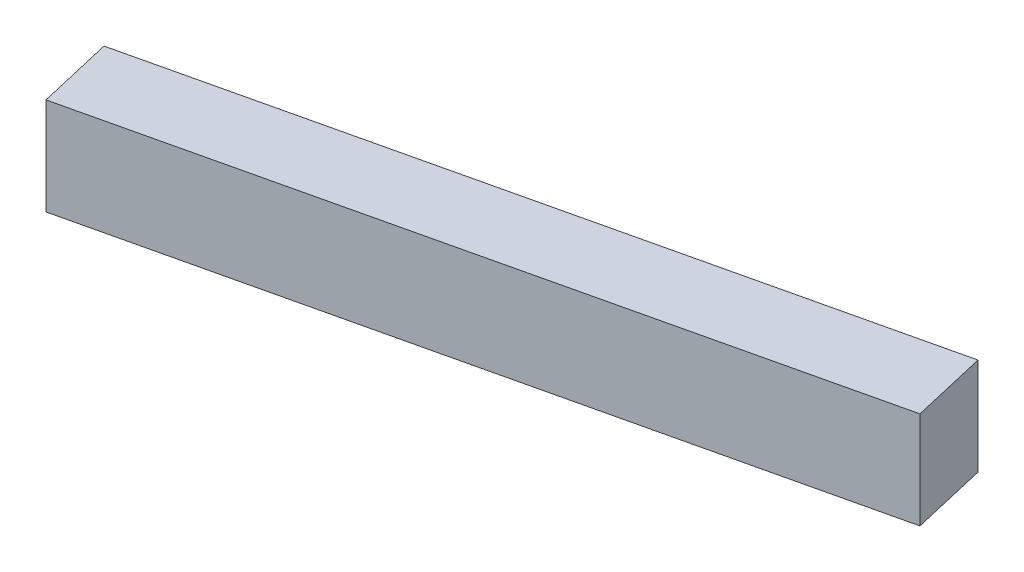
ISO-10303-21;
HEADER;
FILE_DESCRIPTION(('STEP AP214'),'2;1');
FILE_NAME('part.step','',(''),(''),'','','');
FILE_SCHEMA(('AUTOMOTIVE_DESIGN { 1 0 10303 214 1 1 1 1 }'));
ENDSEC;
DATA;
#1=APPLICATION_CONTEXT('core data for automotive mechanical design processes');
#2=APPLICATION_PROTOCOL_DEFINITION('international standard','automotive_design',2000,#1);
#3=PRODUCT_CONTEXT('',#1,'mechanical');
#4=PRODUCT('Part','Part','',(#3));
#5=PRODUCT_RELATED_PRODUCT_CATEGORY('part','',(#4));
#6=PRODUCT_DEFINITION_FORMATION('','',#4);
#7=PRODUCT_DEFINITION_CONTEXT('part definition',#1,'design');
#8=PRODUCT_DEFINITION('design','',#6,#7);
#9=PRODUCT_DEFINITION_SHAPE('','',#8);
#10=(LENGTH_UNIT() NAMED_UNIT(*) SI_UNIT(.MILLI.,.METRE.));
#11=(NAMED_UNIT(*) PLANE_ANGLE_UNIT() SI_UNIT($,.RADIAN.));
#12=(NAMED_UNIT(*) SI_UNIT($,.STERADIAN.) SOLID_ANGLE_UNIT());
#13=UNCERTAINTY_MEASURE_WITH_UNIT(LENGTH_MEASURE(1.E-05),#10,'distance_accuracy_value','');
#14=(GEOMETRIC_REPRESENTATION_CONTEXT(3) GLOBAL_UNCERTAINTY_ASSIGNED_CONTEXT((#13)) GLOBAL_UNIT_ASSIGNED_CONTEXT((#10,
#11,#12)) REPRESENTATION_CONTEXT('',''));
#15=CARTESIAN_POINT('',(0.,0.,0.));
#16=DIRECTION('',(0.,0.,1.));
#17=DIRECTION('',(1.,0.,0.));
#18=AXIS2_PLACEMENT_3D('',#15,#16,#17);
#19=CARTESIAN_POINT('',(17.5061287334921,7.874,-4.17952499772163));
#20=DIRECTION('',(0.226787297927744,0.,0.9739443112923));
#21=DIRECTION('',(0.9739443112923,0.,-0.226787297927744));
#22=AXIS2_PLACEMENT_3D('',#19,#20,#21);
#23=PLANE('',#22);
#24=DIRECTION('',(0.,1.,0.));
#25=VECTOR('',#24,1.);
#26=CARTESIAN_POINT('',(17.5061287334921,7.874,-4.17952499772163));
#27=LINE('',#26,#25);
#28=CARTESIAN_POINT('',(17.5061287334921,7.62,-4.17952499772163));
#29=VERTEX_POINT('',#28);
#30=CARTESIAN_POINT('',(17.5061287334921,7.874,-4.17952499772163));
#31=VERTEX_POINT('',#30);
#32=EDGE_CURVE('E20',#29,#31,#27,.T.);
#33=ORIENTED_EDGE('',*,*,#32,.T.);
#34=DIRECTION('',(0.973944311292298,0.,-0.226787297927751));
#35=VECTOR('',#34,1.);
#36=CARTESIAN_POINT('',(17.5061287334921,7.874,-4.17952499772163));
#37=LINE('',#36,#35);
#38=CARTESIAN_POINT('',(19.3614926465039,7.874,-4.61155480027399));
#39=VERTEX_POINT('',#38);
#40=EDGE_CURVE('E55',#31,#39,#37,.T.);
#41=ORIENTED_EDGE('',*,*,#40,.T.);
#42=DIRECTION('',(0.,1.,0.));
#43=VECTOR('',#42,1.);
#44=CARTESIAN_POINT('',(19.3614926465039,7.874,-4.61155480027399));
#45=LINE('',#44,#43);
#46=CARTESIAN_POINT('',(19.3614926465039,7.62,-4.61155480027398));
#47=VERTEX_POINT('',#46);
#48=EDGE_CURVE('E76',#39,#47,#45,.F.);
#49=ORIENTED_EDGE('',*,*,#48,.T.);
#50=DIRECTION('',(0.973944311292298,0.,-0.226787297927751));
#51=VECTOR('',#50,1.);
#52=CARTESIAN_POINT('',(17.5061287334921,7.62,-4.17952499772163));
#53=LINE('',#52,#51);
#54=EDGE_CURVE('E58',#29,#47,#53,.T.);
#55=ORIENTED_EDGE('',*,*,#54,.F.);
#56=EDGE_LOOP('',(#33,#41,#49,#55));
#57=FACE_BOUND('',#56,.T.);
#58=ADVANCED_FACE('F17',(#57),#23,.F.);
#59=CARTESIAN_POINT('',(17.5061287334921,7.874,-4.17952499772163));
#60=DIRECTION('',(0.973944311292292,0.,-0.22678729792778));
#61=DIRECTION('',(-0.22678729792778,0.,-0.973944311292292));
#62=AXIS2_PLACEMENT_3D('',#59,#60,#61);
#63=PLANE('',#62);
#64=DIRECTION('',(0.,1.,0.));
#65=VECTOR('',#64,1.);
#66=CARTESIAN_POINT('',(17.552211912431,7.874,-3.98161951366704));
#67=LINE('',#66,#65);
#68=CARTESIAN_POINT('',(17.552211912431,7.62,-3.98161951366704));
#69=VERTEX_POINT('',#68);
#70=CARTESIAN_POINT('',(17.552211912431,7.874,-3.98161951366704));
#71=VERTEX_POINT('',#70);
#72=EDGE_CURVE('E73',#69,#71,#67,.T.);
#73=ORIENTED_EDGE('',*,*,#72,.T.);
#74=DIRECTION('',(-0.226787297927654,0.,-0.973944311292321));
#75=VECTOR('',#74,1.);
#76=CARTESIAN_POINT('',(17.552211912431,7.874,-3.98161951366704));
#77=LINE('',#76,#75);
#78=EDGE_CURVE('E63',#71,#31,#77,.T.);
#79=ORIENTED_EDGE('',*,*,#78,.T.);
#80=ORIENTED_EDGE('',*,*,#32,.F.);
#81=DIRECTION('',(-0.226787297927654,0.,-0.973944311292321));
#82=VECTOR('',#81,1.);
#83=CARTESIAN_POINT('',(17.552211912431,7.62,-3.98161951366704));
#84=LINE('',#83,#82);
#85=EDGE_CURVE('E80',#69,#29,#84,.T.);
#86=ORIENTED_EDGE('',*,*,#85,.F.);
#87=EDGE_LOOP('',(#73,#79,#80,#86));
#88=FACE_BOUND('',#87,.T.);
#89=ADVANCED_FACE('F72',(#88),#63,.F.);
#90=CARTESIAN_POINT('',(17.5061287334921,7.874,-4.17952499772163));
#91=DIRECTION('',(0.,-1.,0.));
#92=DIRECTION('',(0.,0.,-1.));
#93=AXIS2_PLACEMENT_3D('',#90,#91,#92);
#94=PLANE('',#93);
#95=ORIENTED_EDGE('',*,*,#78,.F.);
#96=DIRECTION('',(-0.973944311292301,0.,0.226787297927741));
#97=VECTOR('',#96,1.);
#98=CARTESIAN_POINT('',(17.552211912431,7.874,-3.98161951366704));
#99=LINE('',#98,#97);
#100=CARTESIAN_POINT('',(19.4075758257441,7.874,-4.41364931628954));
#101=VERTEX_POINT('',#100);
#102=EDGE_CURVE('E83',#71,#101,#99,.F.);
#103=ORIENTED_EDGE('',*,*,#102,.T.);
#104=DIRECTION('',(0.226787299410367,0.,0.973944310947065));
#105=VECTOR('',#104,1.);
#106=CARTESIAN_POINT('',(19.3614926465039,7.874,-4.61155480027399));
#107=LINE('',#106,#105);
#108=EDGE_CURVE('E69',#101,#39,#107,.F.);
#109=ORIENTED_EDGE('',*,*,#108,.T.);
#110=ORIENTED_EDGE('',*,*,#40,.F.);
#111=EDGE_LOOP('',(#95,#103,#109,#110));
#112=FACE_BOUND('',#111,.T.);
#113=ADVANCED_FACE('F66',(#112),#94,.F.);
#114=CARTESIAN_POINT('',(19.3614926465039,7.874,-4.61155480027399));
#115=DIRECTION('',(-0.973944310947065,0.,0.226787299410367));
#116=DIRECTION('',(0.226787299410367,0.,0.973944310947065));
#117=AXIS2_PLACEMENT_3D('',#114,#115,#116);
#118=PLANE('',#117);
#119=ORIENTED_EDGE('',*,*,#48,.F.);
#120=ORIENTED_EDGE('',*,*,#108,.F.);
#121=DIRECTION('',(0.,1.,0.));
#122=VECTOR('',#121,1.);
#123=CARTESIAN_POINT('',(19.4075758257441,7.874,-4.41364931628954));
#124=LINE('',#123,#122);
#125=CARTESIAN_POINT('',(19.4075758257441,7.62,-4.41364931628954));
#126=VERTEX_POINT('',#125);
#127=EDGE_CURVE('E26',#101,#126,#124,.F.);
#128=ORIENTED_EDGE('',*,*,#127,.T.);
#129=DIRECTION('',(0.226787299410429,0.,0.97394431094705));
#130=VECTOR('',#129,1.);
#131=CARTESIAN_POINT('',(19.3614926465039,7.62,-4.61155480027399));
#132=LINE('',#131,#130);
#133=EDGE_CURVE('E34',#47,#126,#132,.T.);
#134=ORIENTED_EDGE('',*,*,#133,.F.);
#135=EDGE_LOOP('',(#119,#120,#128,#134));
#136=FACE_BOUND('',#135,.T.);
#137=ADVANCED_FACE('F88',(#136),#118,.F.);
#138=CARTESIAN_POINT('',(17.5061287334921,7.62,-4.17952499772163));
#139=DIRECTION('',(0.,-1.,0.));
#140=DIRECTION('',(0.,0.,-1.));
#141=AXIS2_PLACEMENT_3D('',#138,#139,#140);
#142=PLANE('',#141);
#143=DIRECTION('',(-0.973944311292301,0.,0.226787297927741));
#144=VECTOR('',#143,1.);
#145=CARTESIAN_POINT('',(17.552211912431,7.62,-3.98161951366704));
#146=LINE('',#145,#144);
#147=EDGE_CURVE('E11',#126,#69,#146,.T.);
#148=ORIENTED_EDGE('',*,*,#147,.T.);
#149=ORIENTED_EDGE('',*,*,#85,.T.);
#150=ORIENTED_EDGE('',*,*,#54,.T.);
#151=ORIENTED_EDGE('',*,*,#133,.T.);
#152=EDGE_LOOP('',(#148,#149,#150,#151));
#153=FACE_BOUND('',#152,.T.);
#154=ADVANCED_FACE('F91',(#153),#142,.T.);
#155=CARTESIAN_POINT('',(17.552211912431,7.874,-3.98161951366704));
#156=DIRECTION('',(-0.226787297927741,0.,-0.973944311292301));
#157=DIRECTION('',(-0.973944311292301,0.,0.226787297927741));
#158=AXIS2_PLACEMENT_3D('',#155,#156,#157);
#159=PLANE('',#158);
#160=ORIENTED_EDGE('',*,*,#127,.F.);
#161=ORIENTED_EDGE('',*,*,#102,.F.);
#162=ORIENTED_EDGE('',*,*,#72,.F.);
#163=ORIENTED_EDGE('',*,*,#147,.F.);
#164=EDGE_LOOP('',(#160,#161,#162,#163));
#165=FACE_BOUND('',#164,.T.);
#166=ADVANCED_FACE('F90',(#165),#159,.F.);
#167=CLOSED_SHELL('',(#58,#89,#113,#137,#154,#166));
#168=MANIFOLD_SOLID_BREP('B1',#167);
#169=ADVANCED_BREP_SHAPE_REPRESENTATION('',(#18,#168),#14);
#170=SHAPE_DEFINITION_REPRESENTATION(#9,#169);
ENDSEC;
END-ISO-10303-21;
